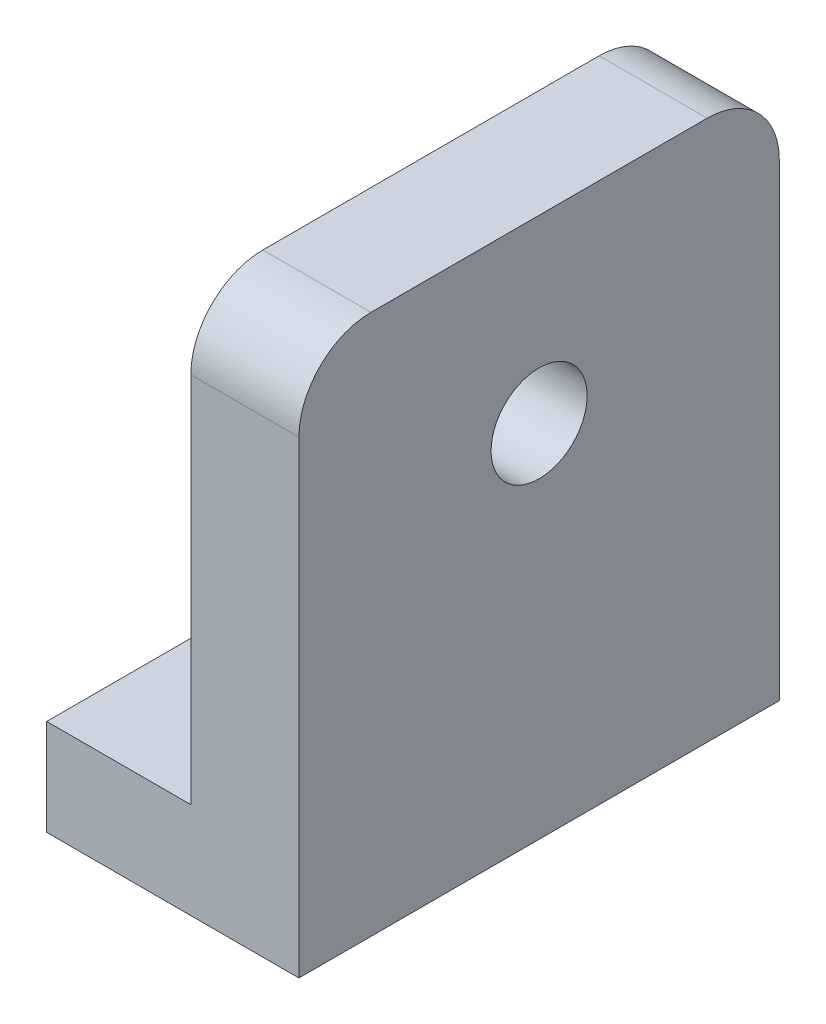
ISO-10303-21;
HEADER;
FILE_DESCRIPTION(('STEP AP214'),'2;1');
FILE_NAME('part.step','',(''),(''),'','','');
FILE_SCHEMA(('AUTOMOTIVE_DESIGN { 1 0 10303 214 1 1 1 1 }'));
ENDSEC;
DATA;
#1=APPLICATION_CONTEXT('core data for automotive mechanical design processes');
#2=APPLICATION_PROTOCOL_DEFINITION('international standard','automotive_design',2000,#1);
#3=PRODUCT_CONTEXT('',#1,'mechanical');
#4=PRODUCT('Part','Part','',(#3));
#5=PRODUCT_RELATED_PRODUCT_CATEGORY('part','',(#4));
#6=PRODUCT_DEFINITION_FORMATION('','',#4);
#7=PRODUCT_DEFINITION_CONTEXT('part definition',#1,'design');
#8=PRODUCT_DEFINITION('design','',#6,#7);
#9=PRODUCT_DEFINITION_SHAPE('','',#8);
#10=(LENGTH_UNIT() NAMED_UNIT(*) SI_UNIT(.MILLI.,.METRE.));
#11=(NAMED_UNIT(*) PLANE_ANGLE_UNIT() SI_UNIT($,.RADIAN.));
#12=(NAMED_UNIT(*) SI_UNIT($,.STERADIAN.) SOLID_ANGLE_UNIT());
#13=UNCERTAINTY_MEASURE_WITH_UNIT(LENGTH_MEASURE(1.E-05),#10,'distance_accuracy_value','');
#14=(GEOMETRIC_REPRESENTATION_CONTEXT(3) GLOBAL_UNCERTAINTY_ASSIGNED_CONTEXT((#13)) GLOBAL_UNIT_ASSIGNED_CONTEXT((#10,
#11,#12)) REPRESENTATION_CONTEXT('',''));
#15=CARTESIAN_POINT('',(0.,0.,0.));
#16=DIRECTION('',(0.,0.,1.));
#17=DIRECTION('',(1.,0.,0.));
#18=AXIS2_PLACEMENT_3D('',#15,#16,#17);
#19=CARTESIAN_POINT('',(0.,0.,40.));
#20=DIRECTION('',(-1.,0.,0.));
#21=DIRECTION('',(0.,0.,1.));
#22=AXIS2_PLACEMENT_3D('',#19,#20,#21);
#23=PLANE('',#22);
#24=CARTESIAN_POINT('',(0.,30.,20.));
#25=DIRECTION('',(-1.,0.,0.));
#26=DIRECTION('',(0.,0.,1.));
#27=AXIS2_PLACEMENT_3D('',#24,#25,#26);
#28=CIRCLE('',#27,4.);
#29=CARTESIAN_POINT('',(0.,30.,24.));
#30=VERTEX_POINT('',#29);
#31=EDGE_CURVE('E147',#30,#30,#28,.T.);
#32=ORIENTED_EDGE('',*,*,#31,.T.);
#33=EDGE_LOOP('',(#32));
#34=FACE_BOUND('',#33,.T.);
#35=DIRECTION('',(0.,1.,0.));
#36=VECTOR('',#35,1.);
#37=CARTESIAN_POINT('',(0.,0.,0.));
#38=LINE('',#37,#36);
#39=CARTESIAN_POINT('',(0.,0.,0.));
#40=VERTEX_POINT('',#39);
#41=CARTESIAN_POINT('',(0.,39.,0.));
#42=VERTEX_POINT('',#41);
#43=EDGE_CURVE('E144',#40,#42,#38,.T.);
#44=ORIENTED_EDGE('',*,*,#43,.T.);
#45=CARTESIAN_POINT('',(0.,39.,6.));
#46=DIRECTION('',(-1.,0.,0.));
#47=DIRECTION('',(0.,0.,1.));
#48=AXIS2_PLACEMENT_3D('',#45,#46,#47);
#49=CIRCLE('',#48,6.);
#50=CARTESIAN_POINT('',(0.,45.,6.));
#51=VERTEX_POINT('',#50);
#52=EDGE_CURVE('E48',#42,#51,#49,.F.);
#53=ORIENTED_EDGE('',*,*,#52,.T.);
#54=DIRECTION('',(0.,0.,-1.));
#55=VECTOR('',#54,1.);
#56=CARTESIAN_POINT('',(0.,45.,40.));
#57=LINE('',#56,#55);
#58=CARTESIAN_POINT('',(0.,45.,34.));
#59=VERTEX_POINT('',#58);
#60=EDGE_CURVE('E170',#59,#51,#57,.T.);
#61=ORIENTED_EDGE('',*,*,#60,.F.);
#62=CARTESIAN_POINT('',(0.,39.,34.));
#63=DIRECTION('',(-1.,0.,0.));
#64=DIRECTION('',(0.,0.,1.));
#65=AXIS2_PLACEMENT_3D('',#62,#63,#64);
#66=CIRCLE('',#65,6.);
#67=CARTESIAN_POINT('',(0.,39.,40.));
#68=VERTEX_POINT('',#67);
#69=EDGE_CURVE('E55',#59,#68,#66,.F.);
#70=ORIENTED_EDGE('',*,*,#69,.T.);
#71=DIRECTION('',(0.,1.,0.));
#72=VECTOR('',#71,1.);
#73=CARTESIAN_POINT('',(0.,0.,40.));
#74=LINE('',#73,#72);
#75=CARTESIAN_POINT('',(0.,0.,40.));
#76=VERTEX_POINT('',#75);
#77=EDGE_CURVE('E117',#76,#68,#74,.T.);
#78=ORIENTED_EDGE('',*,*,#77,.F.);
#79=DIRECTION('',(0.,0.,-1.));
#80=VECTOR('',#79,1.);
#81=CARTESIAN_POINT('',(0.,0.,40.));
#82=LINE('',#81,#80);
#83=EDGE_CURVE('E143',#76,#40,#82,.T.);
#84=ORIENTED_EDGE('',*,*,#83,.T.);
#85=EDGE_LOOP('',(#44,#53,#61,#70,#78,#84));
#86=FACE_BOUND('',#85,.T.);
#87=ADVANCED_FACE('F39',(#34,#86),#23,.F.);
#88=CARTESIAN_POINT('',(0.,45.,40.));
#89=DIRECTION('',(0.,-1.,0.));
#90=DIRECTION('',(0.,0.,-1.));
#91=AXIS2_PLACEMENT_3D('',#88,#89,#90);
#92=PLANE('',#91);
#93=ORIENTED_EDGE('',*,*,#60,.T.);
#94=DIRECTION('',(-1.,0.,0.));
#95=VECTOR('',#94,1.);
#96=CARTESIAN_POINT('',(0.,45.,6.));
#97=LINE('',#96,#95);
#98=CARTESIAN_POINT('',(-9.,45.,6.));
#99=VERTEX_POINT('',#98);
#100=EDGE_CURVE('E177',#51,#99,#97,.T.);
#101=ORIENTED_EDGE('',*,*,#100,.T.);
#102=DIRECTION('',(0.,0.,-1.));
#103=VECTOR('',#102,1.);
#104=CARTESIAN_POINT('',(-9.,45.,40.));
#105=LINE('',#104,#103);
#106=CARTESIAN_POINT('',(-9.,45.,34.));
#107=VERTEX_POINT('',#106);
#108=EDGE_CURVE('E127',#107,#99,#105,.T.);
#109=ORIENTED_EDGE('',*,*,#108,.F.);
#110=DIRECTION('',(-1.,0.,0.));
#111=VECTOR('',#110,1.);
#112=CARTESIAN_POINT('',(0.,45.,34.));
#113=LINE('',#112,#111);
#114=EDGE_CURVE('E174',#107,#59,#113,.F.);
#115=ORIENTED_EDGE('',*,*,#114,.T.);
#116=EDGE_LOOP('',(#93,#101,#109,#115));
#117=FACE_BOUND('',#116,.T.);
#118=ADVANCED_FACE('F195',(#117),#92,.F.);
#119=CARTESIAN_POINT('',(-9.,45.,40.));
#120=DIRECTION('',(1.,0.,0.));
#121=DIRECTION('',(0.,0.,-1.));
#122=AXIS2_PLACEMENT_3D('',#119,#120,#121);
#123=PLANE('',#122);
#124=CARTESIAN_POINT('',(-9.,30.,20.));
#125=DIRECTION('',(-1.,0.,0.));
#126=DIRECTION('',(0.,0.,1.));
#127=AXIS2_PLACEMENT_3D('',#124,#125,#126);
#128=CIRCLE('',#127,4.);
#129=CARTESIAN_POINT('',(-9.,30.,24.));
#130=VERTEX_POINT('',#129);
#131=EDGE_CURVE('E211',#130,#130,#128,.T.);
#132=ORIENTED_EDGE('',*,*,#131,.F.);
#133=EDGE_LOOP('',(#132));
#134=FACE_BOUND('',#133,.T.);
#135=ORIENTED_EDGE('',*,*,#108,.T.);
#136=CARTESIAN_POINT('',(-9.,39.,6.));
#137=DIRECTION('',(1.,0.,0.));
#138=DIRECTION('',(0.,0.,-1.));
#139=AXIS2_PLACEMENT_3D('',#136,#137,#138);
#140=CIRCLE('',#139,6.);
#141=CARTESIAN_POINT('',(-9.,39.,0.));
#142=VERTEX_POINT('',#141);
#143=EDGE_CURVE('E184',#99,#142,#140,.F.);
#144=ORIENTED_EDGE('',*,*,#143,.T.);
#145=DIRECTION('',(0.,-1.,0.));
#146=VECTOR('',#145,1.);
#147=CARTESIAN_POINT('',(-9.,45.,0.));
#148=LINE('',#147,#146);
#149=CARTESIAN_POINT('',(-9.,8.,0.));
#150=VERTEX_POINT('',#149);
#151=EDGE_CURVE('E123',#142,#150,#148,.T.);
#152=ORIENTED_EDGE('',*,*,#151,.T.);
#153=DIRECTION('',(0.,0.,-1.));
#154=VECTOR('',#153,1.);
#155=CARTESIAN_POINT('',(-9.,8.,40.));
#156=LINE('',#155,#154);
#157=CARTESIAN_POINT('',(-9.,8.,40.));
#158=VERTEX_POINT('',#157);
#159=EDGE_CURVE('E120',#158,#150,#156,.T.);
#160=ORIENTED_EDGE('',*,*,#159,.F.);
#161=DIRECTION('',(0.,-1.,0.));
#162=VECTOR('',#161,1.);
#163=CARTESIAN_POINT('',(-9.,45.,40.));
#164=LINE('',#163,#162);
#165=CARTESIAN_POINT('',(-9.,39.,40.));
#166=VERTEX_POINT('',#165);
#167=EDGE_CURVE('E108',#166,#158,#164,.T.);
#168=ORIENTED_EDGE('',*,*,#167,.F.);
#169=CARTESIAN_POINT('',(-9.,39.,34.));
#170=DIRECTION('',(1.,0.,0.));
#171=DIRECTION('',(0.,0.,-1.));
#172=AXIS2_PLACEMENT_3D('',#169,#170,#171);
#173=CIRCLE('',#172,6.);
#174=EDGE_CURVE('E181',#166,#107,#173,.F.);
#175=ORIENTED_EDGE('',*,*,#174,.T.);
#176=EDGE_LOOP('',(#135,#144,#152,#160,#168,#175));
#177=FACE_BOUND('',#176,.T.);
#178=ADVANCED_FACE('F122',(#134,#177),#123,.F.);
#179=CARTESIAN_POINT('',(-21.,8.,40.));
#180=DIRECTION('',(0.,-1.,0.));
#181=DIRECTION('',(0.,0.,-1.));
#182=AXIS2_PLACEMENT_3D('',#179,#180,#181);
#183=PLANE('',#182);
#184=DIRECTION('',(-1.,0.,0.));
#185=VECTOR('',#184,1.);
#186=CARTESIAN_POINT('',(-21.,8.,0.));
#187=LINE('',#186,#185);
#188=CARTESIAN_POINT('',(-21.,8.,0.));
#189=VERTEX_POINT('',#188);
#190=EDGE_CURVE('E150',#150,#189,#187,.T.);
#191=ORIENTED_EDGE('',*,*,#190,.T.);
#192=DIRECTION('',(0.,0.,-1.));
#193=VECTOR('',#192,1.);
#194=CARTESIAN_POINT('',(-21.,8.,40.));
#195=LINE('',#194,#193);
#196=CARTESIAN_POINT('',(-21.,8.,40.));
#197=VERTEX_POINT('',#196);
#198=EDGE_CURVE('E128',#197,#189,#195,.T.);
#199=ORIENTED_EDGE('',*,*,#198,.F.);
#200=DIRECTION('',(-1.,0.,0.));
#201=VECTOR('',#200,1.);
#202=CARTESIAN_POINT('',(-21.,8.,40.));
#203=LINE('',#202,#201);
#204=EDGE_CURVE('E112',#158,#197,#203,.T.);
#205=ORIENTED_EDGE('',*,*,#204,.F.);
#206=ORIENTED_EDGE('',*,*,#159,.T.);
#207=EDGE_LOOP('',(#191,#199,#205,#206));
#208=FACE_BOUND('',#207,.T.);
#209=ADVANCED_FACE('F130',(#208),#183,.F.);
#210=CARTESIAN_POINT('',(-21.,0.,40.));
#211=DIRECTION('',(1.,0.,0.));
#212=DIRECTION('',(0.,0.,-1.));
#213=AXIS2_PLACEMENT_3D('',#210,#211,#212);
#214=PLANE('',#213);
#215=DIRECTION('',(0.,-1.,0.));
#216=VECTOR('',#215,1.);
#217=CARTESIAN_POINT('',(-21.,0.,0.));
#218=LINE('',#217,#216);
#219=CARTESIAN_POINT('',(-21.,0.,0.));
#220=VERTEX_POINT('',#219);
#221=EDGE_CURVE('E153',#189,#220,#218,.T.);
#222=ORIENTED_EDGE('',*,*,#221,.T.);
#223=DIRECTION('',(0.,0.,-1.));
#224=VECTOR('',#223,1.);
#225=CARTESIAN_POINT('',(-21.,0.,40.));
#226=LINE('',#225,#224);
#227=CARTESIAN_POINT('',(-21.,0.,40.));
#228=VERTEX_POINT('',#227);
#229=EDGE_CURVE('E162',#228,#220,#226,.T.);
#230=ORIENTED_EDGE('',*,*,#229,.F.);
#231=DIRECTION('',(0.,-1.,0.));
#232=VECTOR('',#231,1.);
#233=CARTESIAN_POINT('',(-21.,0.,40.));
#234=LINE('',#233,#232);
#235=EDGE_CURVE('E134',#197,#228,#234,.T.);
#236=ORIENTED_EDGE('',*,*,#235,.F.);
#237=ORIENTED_EDGE('',*,*,#198,.T.);
#238=EDGE_LOOP('',(#222,#230,#236,#237));
#239=FACE_BOUND('',#238,.T.);
#240=ADVANCED_FACE('F203',(#239),#214,.F.);
#241=CARTESIAN_POINT('',(0.,0.,40.));
#242=DIRECTION('',(0.,1.,0.));
#243=DIRECTION('',(0.,0.,1.));
#244=AXIS2_PLACEMENT_3D('',#241,#242,#243);
#245=PLANE('',#244);
#246=DIRECTION('',(1.,0.,0.));
#247=VECTOR('',#246,1.);
#248=CARTESIAN_POINT('',(0.,0.,0.));
#249=LINE('',#248,#247);
#250=EDGE_CURVE('E156',#220,#40,#249,.T.);
#251=ORIENTED_EDGE('',*,*,#250,.T.);
#252=ORIENTED_EDGE('',*,*,#83,.F.);
#253=DIRECTION('',(1.,0.,0.));
#254=VECTOR('',#253,1.);
#255=CARTESIAN_POINT('',(0.,0.,40.));
#256=LINE('',#255,#254);
#257=EDGE_CURVE('E137',#228,#76,#256,.T.);
#258=ORIENTED_EDGE('',*,*,#257,.F.);
#259=ORIENTED_EDGE('',*,*,#229,.T.);
#260=EDGE_LOOP('',(#251,#252,#258,#259));
#261=FACE_BOUND('',#260,.T.);
#262=ADVANCED_FACE('F208',(#261),#245,.F.);
#263=CARTESIAN_POINT('',(0.,0.,40.));
#264=DIRECTION('',(0.,0.,1.));
#265=DIRECTION('',(1.,0.,0.));
#266=AXIS2_PLACEMENT_3D('',#263,#264,#265);
#267=PLANE('',#266);
#268=ORIENTED_EDGE('',*,*,#77,.T.);
#269=DIRECTION('',(-1.,0.,0.));
#270=VECTOR('',#269,1.);
#271=CARTESIAN_POINT('',(-9.,39.,40.));
#272=LINE('',#271,#270);
#273=EDGE_CURVE('E11',#68,#166,#272,.T.);
#274=ORIENTED_EDGE('',*,*,#273,.T.);
#275=ORIENTED_EDGE('',*,*,#167,.T.);
#276=ORIENTED_EDGE('',*,*,#204,.T.);
#277=ORIENTED_EDGE('',*,*,#235,.T.);
#278=ORIENTED_EDGE('',*,*,#257,.T.);
#279=EDGE_LOOP('',(#268,#274,#275,#276,#277,#278));
#280=FACE_BOUND('',#279,.T.);
#281=ADVANCED_FACE('F110',(#280),#267,.T.);
#282=CARTESIAN_POINT('',(0.,0.,0.));
#283=DIRECTION('',(0.,0.,1.));
#284=DIRECTION('',(1.,0.,0.));
#285=AXIS2_PLACEMENT_3D('',#282,#283,#284);
#286=PLANE('',#285);
#287=ORIENTED_EDGE('',*,*,#151,.F.);
#288=DIRECTION('',(-1.,0.,0.));
#289=VECTOR('',#288,1.);
#290=CARTESIAN_POINT('',(0.,39.,0.));
#291=LINE('',#290,#289);
#292=EDGE_CURVE('E63',#142,#42,#291,.F.);
#293=ORIENTED_EDGE('',*,*,#292,.T.);
#294=ORIENTED_EDGE('',*,*,#43,.F.);
#295=ORIENTED_EDGE('',*,*,#250,.F.);
#296=ORIENTED_EDGE('',*,*,#221,.F.);
#297=ORIENTED_EDGE('',*,*,#190,.F.);
#298=EDGE_LOOP('',(#287,#293,#294,#295,#296,#297));
#299=FACE_BOUND('',#298,.T.);
#300=ADVANCED_FACE('F199',(#299),#286,.F.);
#301=CARTESIAN_POINT('',(0.,39.,6.));
#302=DIRECTION('',(-1.,0.,0.));
#303=DIRECTION('',(0.,0.,1.));
#304=AXIS2_PLACEMENT_3D('',#301,#302,#303);
#305=CYLINDRICAL_SURFACE('',#304,6.);
#306=ORIENTED_EDGE('',*,*,#52,.F.);
#307=ORIENTED_EDGE('',*,*,#292,.F.);
#308=ORIENTED_EDGE('',*,*,#143,.F.);
#309=ORIENTED_EDGE('',*,*,#100,.F.);
#310=EDGE_LOOP('',(#306,#307,#308,#309));
#311=FACE_BOUND('',#310,.T.);
#312=ADVANCED_FACE('F198',(#311),#305,.T.);
#313=CARTESIAN_POINT('',(0.,39.,34.));
#314=DIRECTION('',(1.,0.,0.));
#315=DIRECTION('',(0.,0.,-1.));
#316=AXIS2_PLACEMENT_3D('',#313,#314,#315);
#317=CYLINDRICAL_SURFACE('',#316,6.);
#318=ORIENTED_EDGE('',*,*,#69,.F.);
#319=ORIENTED_EDGE('',*,*,#114,.F.);
#320=ORIENTED_EDGE('',*,*,#174,.F.);
#321=ORIENTED_EDGE('',*,*,#273,.F.);
#322=EDGE_LOOP('',(#318,#319,#320,#321));
#323=FACE_BOUND('',#322,.T.);
#324=ADVANCED_FACE('F41',(#323),#317,.T.);
#325=CARTESIAN_POINT('',(0.,30.,20.));
#326=DIRECTION('',(-1.,0.,0.));
#327=DIRECTION('',(0.,0.,1.));
#328=AXIS2_PLACEMENT_3D('',#325,#326,#327);
#329=CYLINDRICAL_SURFACE('',#328,4.);
#330=ORIENTED_EDGE('',*,*,#31,.F.);
#331=EDGE_LOOP('',(#330));
#332=FACE_BOUND('',#331,.T.);
#333=ORIENTED_EDGE('',*,*,#131,.T.);
#334=EDGE_LOOP('',(#333));
#335=FACE_BOUND('',#334,.T.);
#336=ADVANCED_FACE('F220',(#332,#335),#329,.F.);
#337=CLOSED_SHELL('',(#87,#118,#178,#209,#240,#262,#281,#300,#312,#324,#336));
#338=MANIFOLD_SOLID_BREP('B2',#337);
#339=ADVANCED_BREP_SHAPE_REPRESENTATION('',(#18,#338),#14);
#340=SHAPE_DEFINITION_REPRESENTATION(#9,#339);
ENDSEC;
END-ISO-10303-21;
